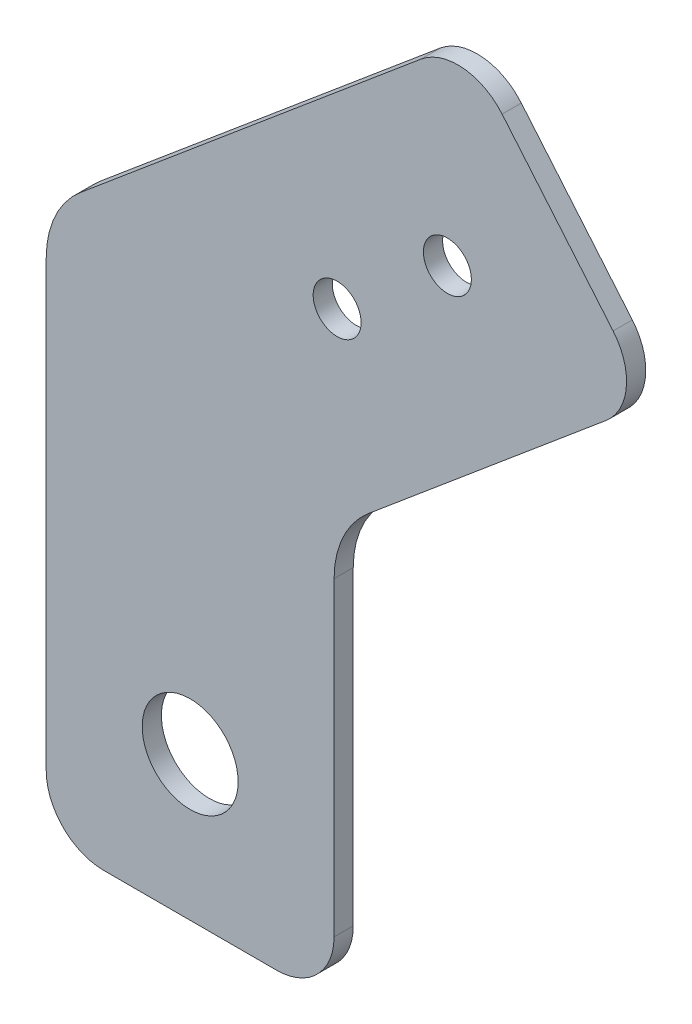
ISO-10303-21;
HEADER;
FILE_DESCRIPTION(('STEP AP214'),'2;1');
FILE_NAME('part.step','',(''),(''),'','','');
FILE_SCHEMA(('AUTOMOTIVE_DESIGN { 1 0 10303 214 1 1 1 1 }'));
ENDSEC;
DATA;
#1=APPLICATION_CONTEXT('core data for automotive mechanical design processes');
#2=APPLICATION_PROTOCOL_DEFINITION('international standard','automotive_design',2000,#1);
#3=PRODUCT_CONTEXT('',#1,'mechanical');
#4=PRODUCT('Part','Part','',(#3));
#5=PRODUCT_RELATED_PRODUCT_CATEGORY('part','',(#4));
#6=PRODUCT_DEFINITION_FORMATION('','',#4);
#7=PRODUCT_DEFINITION_CONTEXT('part definition',#1,'design');
#8=PRODUCT_DEFINITION('design','',#6,#7);
#9=PRODUCT_DEFINITION_SHAPE('','',#8);
#10=(LENGTH_UNIT() NAMED_UNIT(*) SI_UNIT(.MILLI.,.METRE.));
#11=(NAMED_UNIT(*) PLANE_ANGLE_UNIT() SI_UNIT($,.RADIAN.));
#12=(NAMED_UNIT(*) SI_UNIT($,.STERADIAN.) SOLID_ANGLE_UNIT());
#13=UNCERTAINTY_MEASURE_WITH_UNIT(LENGTH_MEASURE(1.E-05),#10,'distance_accuracy_value','');
#14=(GEOMETRIC_REPRESENTATION_CONTEXT(3) GLOBAL_UNCERTAINTY_ASSIGNED_CONTEXT((#13)) GLOBAL_UNIT_ASSIGNED_CONTEXT((#10,
#11,#12)) REPRESENTATION_CONTEXT('',''));
#15=CARTESIAN_POINT('',(0.,0.,0.));
#16=DIRECTION('',(0.,0.,1.));
#17=DIRECTION('',(1.,0.,0.));
#18=AXIS2_PLACEMENT_3D('',#15,#16,#17);
#19=CARTESIAN_POINT('',(-47.3022221559489,-76.1393804843269,-2.));
#20=DIRECTION('',(0.,0.,1.));
#21=DIRECTION('',(1.,0.,0.));
#22=AXIS2_PLACEMENT_3D('',#19,#20,#21);
#23=CYLINDRICAL_SURFACE('',#22,6.);
#24=CARTESIAN_POINT('',(-47.3022221559489,-76.1393804843269,0.));
#25=DIRECTION('',(0.,0.,1.));
#26=DIRECTION('',(-1.,0.,0.));
#27=AXIS2_PLACEMENT_3D('',#24,#25,#26);
#28=CIRCLE('',#27,6.);
#29=CARTESIAN_POINT('',(-53.3022221559489,-76.1393804843269,0.));
#30=VERTEX_POINT('',#29);
#31=CARTESIAN_POINT('',(-47.3022221559489,-82.1393804843269,0.));
#32=VERTEX_POINT('',#31);
#33=EDGE_CURVE('E158',#30,#32,#28,.T.);
#34=ORIENTED_EDGE('',*,*,#33,.F.);
#35=DIRECTION('',(0.,0.,1.));
#36=VECTOR('',#35,1.);
#37=CARTESIAN_POINT('',(-53.3022221559489,-76.1393804843269,-2.));
#38=LINE('',#37,#36);
#39=CARTESIAN_POINT('',(-53.3022221559489,-76.1393804843269,-2.));
#40=VERTEX_POINT('',#39);
#41=EDGE_CURVE('E11',#40,#30,#38,.T.);
#42=ORIENTED_EDGE('',*,*,#41,.F.);
#43=CARTESIAN_POINT('',(-47.3022221559489,-76.1393804843269,-2.));
#44=DIRECTION('',(0.,0.,1.));
#45=DIRECTION('',(-1.,0.,0.));
#46=AXIS2_PLACEMENT_3D('',#43,#44,#45);
#47=CIRCLE('',#46,6.);
#48=CARTESIAN_POINT('',(-47.3022221559489,-82.1393804843269,-2.));
#49=VERTEX_POINT('',#48);
#50=EDGE_CURVE('E189',#40,#49,#47,.T.);
#51=ORIENTED_EDGE('',*,*,#50,.T.);
#52=DIRECTION('',(0.,0.,1.));
#53=VECTOR('',#52,1.);
#54=CARTESIAN_POINT('',(-47.3022221559489,-82.1393804843269,-2.));
#55=LINE('',#54,#53);
#56=EDGE_CURVE('E40',#49,#32,#55,.T.);
#57=ORIENTED_EDGE('',*,*,#56,.T.);
#58=EDGE_LOOP('',(#34,#42,#51,#57));
#59=FACE_BOUND('',#58,.T.);
#60=ADVANCED_FACE('F37',(#59),#23,.T.);
#61=CARTESIAN_POINT('',(-53.3022221559489,-76.1393804843269,-2.));
#62=DIRECTION('',(-1.,0.,0.));
#63=DIRECTION('',(0.,0.,1.));
#64=AXIS2_PLACEMENT_3D('',#61,#62,#63);
#65=PLANE('',#64);
#66=DIRECTION('',(0.,-1.,0.));
#67=VECTOR('',#66,1.);
#68=CARTESIAN_POINT('',(-53.3022221559489,-76.1393804843269,0.));
#69=LINE('',#68,#67);
#70=CARTESIAN_POINT('',(-53.3022221559489,-29.8078421935519,0.));
#71=VERTEX_POINT('',#70);
#72=EDGE_CURVE('E92',#71,#30,#69,.T.);
#73=ORIENTED_EDGE('',*,*,#72,.F.);
#74=DIRECTION('',(0.,0.,1.));
#75=VECTOR('',#74,1.);
#76=CARTESIAN_POINT('',(-53.3022221559489,-29.8078421935519,-2.));
#77=LINE('',#76,#75);
#78=CARTESIAN_POINT('',(-53.3022221559489,-29.8078421935519,-2.));
#79=VERTEX_POINT('',#78);
#80=EDGE_CURVE('E46',#79,#71,#77,.T.);
#81=ORIENTED_EDGE('',*,*,#80,.F.);
#82=DIRECTION('',(0.,-1.,0.));
#83=VECTOR('',#82,1.);
#84=CARTESIAN_POINT('',(-53.3022221559489,-29.8078421935519,-2.));
#85=LINE('',#84,#83);
#86=EDGE_CURVE('E54',#79,#40,#85,.T.);
#87=ORIENTED_EDGE('',*,*,#86,.T.);
#88=ORIENTED_EDGE('',*,*,#41,.T.);
#89=EDGE_LOOP('',(#73,#81,#87,#88));
#90=FACE_BOUND('',#89,.T.);
#91=ADVANCED_FACE('F285',(#90),#65,.T.);
#92=CARTESIAN_POINT('',(-43.3022221559489,-29.8078421935519,-2.));
#93=DIRECTION('',(0.,0.,1.));
#94=DIRECTION('',(1.,0.,0.));
#95=AXIS2_PLACEMENT_3D('',#92,#93,#94);
#96=CYLINDRICAL_SURFACE('',#95,10.);
#97=CARTESIAN_POINT('',(-43.3022221559489,-29.8078421935519,0.));
#98=DIRECTION('',(0.,0.,1.));
#99=DIRECTION('',(1.,0.,0.));
#100=AXIS2_PLACEMENT_3D('',#97,#98,#99);
#101=CIRCLE('',#100,10.);
#102=CARTESIAN_POINT('',(-49.7300982528143,-22.1473977623621,0.));
#103=VERTEX_POINT('',#102);
#104=EDGE_CURVE('E135',#103,#71,#101,.T.);
#105=ORIENTED_EDGE('',*,*,#104,.F.);
#106=DIRECTION('',(0.,0.,1.));
#107=VECTOR('',#106,1.);
#108=CARTESIAN_POINT('',(-49.7300982528143,-22.1473977623621,-2.));
#109=LINE('',#108,#107);
#110=CARTESIAN_POINT('',(-49.7300982528143,-22.1473977623621,-2.));
#111=VERTEX_POINT('',#110);
#112=EDGE_CURVE('E130',#111,#103,#109,.T.);
#113=ORIENTED_EDGE('',*,*,#112,.F.);
#114=CARTESIAN_POINT('',(-43.3022221559489,-29.8078421935519,-2.));
#115=DIRECTION('',(0.,0.,1.));
#116=DIRECTION('',(1.,0.,0.));
#117=AXIS2_PLACEMENT_3D('',#114,#115,#116);
#118=CIRCLE('',#117,10.);
#119=EDGE_CURVE('E133',#111,#79,#118,.T.);
#120=ORIENTED_EDGE('',*,*,#119,.T.);
#121=ORIENTED_EDGE('',*,*,#80,.T.);
#122=EDGE_LOOP('',(#105,#113,#120,#121));
#123=FACE_BOUND('',#122,.T.);
#124=ADVANCED_FACE('F132',(#123),#96,.T.);
#125=CARTESIAN_POINT('',(-14.2380808040119,7.63394098866545,-2.));
#126=DIRECTION('',(-0.642787609686538,0.766044443118979,0.));
#127=DIRECTION('',(-0.766044443118979,-0.642787609686538,0.));
#128=AXIS2_PLACEMENT_3D('',#125,#126,#127);
#129=PLANE('',#128);
#130=DIRECTION('',(-0.766044443118979,-0.642787609686538,0.));
#131=VECTOR('',#130,1.);
#132=CARTESIAN_POINT('',(-14.2380808040119,7.63394098866545,0.));
#133=LINE('',#132,#131);
#134=CARTESIAN_POINT('',(-14.2380808040119,7.63394098866545,0.));
#135=VERTEX_POINT('',#134);
#136=EDGE_CURVE('E186',#135,#103,#133,.T.);
#137=ORIENTED_EDGE('',*,*,#136,.F.);
#138=DIRECTION('',(0.,0.,1.));
#139=VECTOR('',#138,1.);
#140=CARTESIAN_POINT('',(-14.2380808040119,7.63394098866545,-2.));
#141=LINE('',#140,#139);
#142=CARTESIAN_POINT('',(-14.2380808040119,7.63394098866545,-2.));
#143=VERTEX_POINT('',#142);
#144=EDGE_CURVE('E140',#143,#135,#141,.T.);
#145=ORIENTED_EDGE('',*,*,#144,.F.);
#146=DIRECTION('',(-0.766044443118979,-0.642787609686538,0.));
#147=VECTOR('',#146,1.);
#148=CARTESIAN_POINT('',(-14.2380808040119,7.63394098866545,-2.));
#149=LINE('',#148,#147);
#150=EDGE_CURVE('E147',#143,#111,#149,.T.);
#151=ORIENTED_EDGE('',*,*,#150,.T.);
#152=ORIENTED_EDGE('',*,*,#112,.T.);
#153=EDGE_LOOP('',(#137,#145,#151,#152));
#154=FACE_BOUND('',#153,.T.);
#155=ADVANCED_FACE('F150',(#154),#129,.T.);
#156=CARTESIAN_POINT('',(-10.3813551458927,3.03767432995158,-2.));
#157=DIRECTION('',(0.,0.,1.));
#158=DIRECTION('',(1.,0.,0.));
#159=AXIS2_PLACEMENT_3D('',#156,#157,#158);
#160=CYLINDRICAL_SURFACE('',#159,6.);
#161=CARTESIAN_POINT('',(-10.3813551458927,3.03767432995158,0.));
#162=DIRECTION('',(0.,0.,1.));
#163=DIRECTION('',(-1.,0.,0.));
#164=AXIS2_PLACEMENT_3D('',#161,#162,#163);
#165=CIRCLE('',#164,6.);
#166=CARTESIAN_POINT('',(-5.78508848717884,6.89439998807081,0.));
#167=VERTEX_POINT('',#166);
#168=EDGE_CURVE('E183',#167,#135,#165,.T.);
#169=ORIENTED_EDGE('',*,*,#168,.F.);
#170=DIRECTION('',(0.,0.,1.));
#171=VECTOR('',#170,1.);
#172=CARTESIAN_POINT('',(-5.78508848717884,6.89439998807081,-2.));
#173=LINE('',#172,#171);
#174=CARTESIAN_POINT('',(-5.78508848717884,6.89439998807081,-2.));
#175=VERTEX_POINT('',#174);
#176=EDGE_CURVE('E193',#175,#167,#173,.T.);
#177=ORIENTED_EDGE('',*,*,#176,.F.);
#178=CARTESIAN_POINT('',(-10.3813551458927,3.03767432995158,-2.));
#179=DIRECTION('',(0.,0.,1.));
#180=DIRECTION('',(-1.,0.,0.));
#181=AXIS2_PLACEMENT_3D('',#178,#179,#180);
#182=CIRCLE('',#181,6.);
#183=EDGE_CURVE('E151',#175,#143,#182,.T.);
#184=ORIENTED_EDGE('',*,*,#183,.T.);
#185=ORIENTED_EDGE('',*,*,#144,.T.);
#186=EDGE_LOOP('',(#169,#177,#184,#185));
#187=FACE_BOUND('',#186,.T.);
#188=ADVANCED_FACE('F215',(#187),#160,.T.);
#189=CARTESIAN_POINT('',(5.78508848717885,-6.89439998807081,-2.));
#190=DIRECTION('',(0.766044443118979,0.642787609686538,0.));
#191=DIRECTION('',(-0.642787609686538,0.766044443118979,0.));
#192=AXIS2_PLACEMENT_3D('',#189,#190,#191);
#193=PLANE('',#192);
#194=DIRECTION('',(-0.642787609686538,0.766044443118979,0.));
#195=VECTOR('',#194,1.);
#196=CARTESIAN_POINT('',(5.78508848717885,-6.89439998807081,0.));
#197=LINE('',#196,#195);
#198=CARTESIAN_POINT('',(5.78508848717885,-6.89439998807081,0.));
#199=VERTEX_POINT('',#198);
#200=EDGE_CURVE('E180',#199,#167,#197,.T.);
#201=ORIENTED_EDGE('',*,*,#200,.F.);
#202=DIRECTION('',(0.,0.,1.));
#203=VECTOR('',#202,1.);
#204=CARTESIAN_POINT('',(5.78508848717885,-6.89439998807081,-2.));
#205=LINE('',#204,#203);
#206=CARTESIAN_POINT('',(5.78508848717885,-6.89439998807081,-2.));
#207=VERTEX_POINT('',#206);
#208=EDGE_CURVE('E195',#207,#199,#205,.T.);
#209=ORIENTED_EDGE('',*,*,#208,.F.);
#210=DIRECTION('',(-0.642787609686538,0.766044443118979,0.));
#211=VECTOR('',#210,1.);
#212=CARTESIAN_POINT('',(5.78508848717885,-6.89439998807081,-2.));
#213=LINE('',#212,#211);
#214=EDGE_CURVE('E153',#207,#175,#213,.T.);
#215=ORIENTED_EDGE('',*,*,#214,.T.);
#216=ORIENTED_EDGE('',*,*,#176,.T.);
#217=EDGE_LOOP('',(#201,#209,#215,#216));
#218=FACE_BOUND('',#217,.T.);
#219=ADVANCED_FACE('F221',(#218),#193,.T.);
#220=CARTESIAN_POINT('',(1.18882182846497,-10.75112564619,-2.));
#221=DIRECTION('',(0.,0.,1.));
#222=DIRECTION('',(1.,0.,0.));
#223=AXIS2_PLACEMENT_3D('',#220,#221,#222);
#224=CYLINDRICAL_SURFACE('',#223,6.);
#225=CARTESIAN_POINT('',(1.18882182846497,-10.75112564619,0.));
#226=DIRECTION('',(0.,0.,1.));
#227=DIRECTION('',(1.,0.,0.));
#228=AXIS2_PLACEMENT_3D('',#225,#226,#227);
#229=CIRCLE('',#228,6.);
#230=CARTESIAN_POINT('',(5.0455474865842,-15.3473923049039,0.));
#231=VERTEX_POINT('',#230);
#232=EDGE_CURVE('E177',#231,#199,#229,.T.);
#233=ORIENTED_EDGE('',*,*,#232,.F.);
#234=DIRECTION('',(0.,0.,1.));
#235=VECTOR('',#234,1.);
#236=CARTESIAN_POINT('',(5.0455474865842,-15.3473923049039,-2.));
#237=LINE('',#236,#235);
#238=CARTESIAN_POINT('',(5.0455474865842,-15.3473923049039,-2.));
#239=VERTEX_POINT('',#238);
#240=EDGE_CURVE('E197',#239,#231,#237,.T.);
#241=ORIENTED_EDGE('',*,*,#240,.F.);
#242=CARTESIAN_POINT('',(1.18882182846497,-10.75112564619,-2.));
#243=DIRECTION('',(0.,0.,1.));
#244=DIRECTION('',(1.,0.,0.));
#245=AXIS2_PLACEMENT_3D('',#242,#243,#244);
#246=CIRCLE('',#245,6.);
#247=EDGE_CURVE('E222',#239,#207,#246,.T.);
#248=ORIENTED_EDGE('',*,*,#247,.T.);
#249=ORIENTED_EDGE('',*,*,#208,.T.);
#250=EDGE_LOOP('',(#233,#241,#248,#249));
#251=FACE_BOUND('',#250,.T.);
#252=ADVANCED_FACE('F301',(#251),#224,.T.);
#253=CARTESIAN_POINT('',(5.0455474865842,-15.3473923049039,-2.));
#254=DIRECTION('',(0.642787609686538,-0.766044443118979,0.));
#255=DIRECTION('',(0.766044443118979,0.642787609686538,0.));
#256=AXIS2_PLACEMENT_3D('',#253,#254,#255);
#257=PLANE('',#256);
#258=DIRECTION('',(0.766044443118979,0.642787609686538,0.));
#259=VECTOR('',#258,1.);
#260=CARTESIAN_POINT('',(5.0455474865842,-15.3473923049039,0.));
#261=LINE('',#260,#259);
#262=CARTESIAN_POINT('',(-19.7300982528143,-36.1366275070121,0.));
#263=VERTEX_POINT('',#262);
#264=EDGE_CURVE('E174',#263,#231,#261,.T.);
#265=ORIENTED_EDGE('',*,*,#264,.F.);
#266=DIRECTION('',(0.,0.,1.));
#267=VECTOR('',#266,1.);
#268=CARTESIAN_POINT('',(-19.7300982528143,-36.1366275070121,-2.));
#269=LINE('',#268,#267);
#270=CARTESIAN_POINT('',(-19.7300982528143,-36.1366275070121,-2.));
#271=VERTEX_POINT('',#270);
#272=EDGE_CURVE('E199',#271,#263,#269,.T.);
#273=ORIENTED_EDGE('',*,*,#272,.F.);
#274=DIRECTION('',(0.766044443118979,0.642787609686538,0.));
#275=VECTOR('',#274,1.);
#276=CARTESIAN_POINT('',(5.0455474865842,-15.3473923049039,-2.));
#277=LINE('',#276,#275);
#278=EDGE_CURVE('E223',#271,#239,#277,.T.);
#279=ORIENTED_EDGE('',*,*,#278,.T.);
#280=ORIENTED_EDGE('',*,*,#240,.T.);
#281=EDGE_LOOP('',(#265,#273,#279,#280));
#282=FACE_BOUND('',#281,.T.);
#283=ADVANCED_FACE('F304',(#282),#257,.T.);
#284=CARTESIAN_POINT('',(-13.3022221559489,-43.7970719382019,-2.));
#285=DIRECTION('',(0.,0.,1.));
#286=DIRECTION('',(1.,0.,0.));
#287=AXIS2_PLACEMENT_3D('',#284,#285,#286);
#288=CYLINDRICAL_SURFACE('',#287,10.);
#289=CARTESIAN_POINT('',(-13.3022221559489,-43.7970719382019,0.));
#290=DIRECTION('',(0.,0.,-1.));
#291=DIRECTION('',(1.,0.,0.));
#292=AXIS2_PLACEMENT_3D('',#289,#290,#291);
#293=CIRCLE('',#292,10.);
#294=CARTESIAN_POINT('',(-23.302222155949,-43.7970719382019,0.));
#295=VERTEX_POINT('',#294);
#296=EDGE_CURVE('E171',#295,#263,#293,.T.);
#297=ORIENTED_EDGE('',*,*,#296,.F.);
#298=DIRECTION('',(0.,0.,1.));
#299=VECTOR('',#298,1.);
#300=CARTESIAN_POINT('',(-23.302222155949,-43.7970719382019,-2.));
#301=LINE('',#300,#299);
#302=CARTESIAN_POINT('',(-23.302222155949,-43.7970719382019,-2.));
#303=VERTEX_POINT('',#302);
#304=EDGE_CURVE('E201',#303,#295,#301,.T.);
#305=ORIENTED_EDGE('',*,*,#304,.F.);
#306=CARTESIAN_POINT('',(-13.3022221559489,-43.7970719382019,-2.));
#307=DIRECTION('',(0.,0.,-1.));
#308=DIRECTION('',(1.,0.,0.));
#309=AXIS2_PLACEMENT_3D('',#306,#307,#308);
#310=CIRCLE('',#309,10.);
#311=EDGE_CURVE('E228',#303,#271,#310,.T.);
#312=ORIENTED_EDGE('',*,*,#311,.T.);
#313=ORIENTED_EDGE('',*,*,#272,.T.);
#314=EDGE_LOOP('',(#297,#305,#312,#313));
#315=FACE_BOUND('',#314,.T.);
#316=ADVANCED_FACE('F308',(#315),#288,.F.);
#317=CARTESIAN_POINT('',(-23.302222155949,-43.7970719382019,-2.));
#318=DIRECTION('',(1.,0.,0.));
#319=DIRECTION('',(0.,1.,0.));
#320=AXIS2_PLACEMENT_3D('',#317,#318,#319);
#321=PLANE('',#320);
#322=DIRECTION('',(0.,1.,0.));
#323=VECTOR('',#322,1.);
#324=CARTESIAN_POINT('',(-23.302222155949,-43.7970719382019,0.));
#325=LINE('',#324,#323);
#326=CARTESIAN_POINT('',(-23.3022221559489,-76.1393804843269,0.));
#327=VERTEX_POINT('',#326);
#328=EDGE_CURVE('E168',#327,#295,#325,.T.);
#329=ORIENTED_EDGE('',*,*,#328,.F.);
#330=DIRECTION('',(0.,0.,1.));
#331=VECTOR('',#330,1.);
#332=CARTESIAN_POINT('',(-23.3022221559489,-76.1393804843269,-2.));
#333=LINE('',#332,#331);
#334=CARTESIAN_POINT('',(-23.3022221559489,-76.1393804843269,-2.));
#335=VERTEX_POINT('',#334);
#336=EDGE_CURVE('E203',#335,#327,#333,.T.);
#337=ORIENTED_EDGE('',*,*,#336,.F.);
#338=DIRECTION('',(0.,1.,0.));
#339=VECTOR('',#338,1.);
#340=CARTESIAN_POINT('',(-23.3022221559489,-48.561641660225,-2.));
#341=LINE('',#340,#339);
#342=EDGE_CURVE('E231',#335,#303,#341,.T.);
#343=ORIENTED_EDGE('',*,*,#342,.T.);
#344=ORIENTED_EDGE('',*,*,#304,.T.);
#345=EDGE_LOOP('',(#329,#337,#343,#344));
#346=FACE_BOUND('',#345,.T.);
#347=ADVANCED_FACE('F312',(#346),#321,.T.);
#348=CARTESIAN_POINT('',(-29.3022221559489,-76.1393804843269,-2.));
#349=DIRECTION('',(0.,0.,1.));
#350=DIRECTION('',(1.,0.,0.));
#351=AXIS2_PLACEMENT_3D('',#348,#349,#350);
#352=CYLINDRICAL_SURFACE('',#351,6.);
#353=CARTESIAN_POINT('',(-29.3022221559489,-76.1393804843269,0.));
#354=DIRECTION('',(0.,0.,1.));
#355=DIRECTION('',(-1.,0.,0.));
#356=AXIS2_PLACEMENT_3D('',#353,#354,#355);
#357=CIRCLE('',#356,6.);
#358=CARTESIAN_POINT('',(-29.3022221559489,-82.1393804843269,0.));
#359=VERTEX_POINT('',#358);
#360=EDGE_CURVE('E165',#359,#327,#357,.T.);
#361=ORIENTED_EDGE('',*,*,#360,.F.);
#362=DIRECTION('',(0.,0.,1.));
#363=VECTOR('',#362,1.);
#364=CARTESIAN_POINT('',(-29.3022221559489,-82.1393804843269,-2.));
#365=LINE('',#364,#363);
#366=CARTESIAN_POINT('',(-29.3022221559489,-82.1393804843269,-2.));
#367=VERTEX_POINT('',#366);
#368=EDGE_CURVE('E205',#367,#359,#365,.T.);
#369=ORIENTED_EDGE('',*,*,#368,.F.);
#370=CARTESIAN_POINT('',(-29.3022221559489,-76.1393804843269,-2.));
#371=DIRECTION('',(0.,0.,1.));
#372=DIRECTION('',(-1.,0.,0.));
#373=AXIS2_PLACEMENT_3D('',#370,#371,#372);
#374=CIRCLE('',#373,6.);
#375=EDGE_CURVE('E233',#367,#335,#374,.T.);
#376=ORIENTED_EDGE('',*,*,#375,.T.);
#377=ORIENTED_EDGE('',*,*,#336,.T.);
#378=EDGE_LOOP('',(#361,#369,#376,#377));
#379=FACE_BOUND('',#378,.T.);
#380=ADVANCED_FACE('F316',(#379),#352,.T.);
#381=CARTESIAN_POINT('',(-29.3022221559489,-82.1393804843269,-2.));
#382=DIRECTION('',(0.,-1.,0.));
#383=DIRECTION('',(0.,0.,-1.));
#384=AXIS2_PLACEMENT_3D('',#381,#382,#383);
#385=PLANE('',#384);
#386=DIRECTION('',(1.,0.,0.));
#387=VECTOR('',#386,1.);
#388=CARTESIAN_POINT('',(-29.3022221559489,-82.1393804843269,0.));
#389=LINE('',#388,#387);
#390=EDGE_CURVE('E161',#32,#359,#389,.T.);
#391=ORIENTED_EDGE('',*,*,#390,.F.);
#392=ORIENTED_EDGE('',*,*,#56,.F.);
#393=DIRECTION('',(1.,0.,0.));
#394=VECTOR('',#393,1.);
#395=CARTESIAN_POINT('',(-29.3022221559489,-82.1393804843269,-2.));
#396=LINE('',#395,#394);
#397=EDGE_CURVE('E236',#49,#367,#396,.T.);
#398=ORIENTED_EDGE('',*,*,#397,.T.);
#399=ORIENTED_EDGE('',*,*,#368,.T.);
#400=EDGE_LOOP('',(#391,#392,#398,#399));
#401=FACE_BOUND('',#400,.T.);
#402=ADVANCED_FACE('F209',(#401),#385,.T.);
#403=CARTESIAN_POINT('',(-47.3022221559489,-76.1393804843269,-2.));
#404=DIRECTION('',(0.,0.,-1.));
#405=DIRECTION('',(-1.,0.,0.));
#406=AXIS2_PLACEMENT_3D('',#403,#404,#405);
#407=PLANE('',#406);
#408=CARTESIAN_POINT('',(-22.9813332935694,-19.2836282905961,-2.));
#409=DIRECTION('',(0.,0.,1.));
#410=DIRECTION('',(1.,0.,0.));
#411=AXIS2_PLACEMENT_3D('',#408,#409,#410);
#412=CIRCLE('',#411,2.5);
#413=CARTESIAN_POINT('',(-20.4813332935694,-19.2836282905961,-2.));
#414=VERTEX_POINT('',#413);
#415=EDGE_CURVE('E248',#414,#414,#412,.T.);
#416=ORIENTED_EDGE('',*,*,#415,.T.);
#417=EDGE_LOOP('',(#416));
#418=FACE_BOUND('',#417,.T.);
#419=CARTESIAN_POINT('',(-11.4906666467847,-9.64181414529807,-2.));
#420=DIRECTION('',(0.,0.,1.));
#421=DIRECTION('',(1.,0.,0.));
#422=AXIS2_PLACEMENT_3D('',#419,#420,#421);
#423=CIRCLE('',#422,2.5);
#424=CARTESIAN_POINT('',(-8.99066664678469,-9.64181414529807,-2.));
#425=VERTEX_POINT('',#424);
#426=EDGE_CURVE('E242',#425,#425,#423,.T.);
#427=ORIENTED_EDGE('',*,*,#426,.T.);
#428=EDGE_LOOP('',(#427));
#429=FACE_BOUND('',#428,.T.);
#430=CARTESIAN_POINT('',(-38.3022221559489,-67.1393804843269,-2.));
#431=DIRECTION('',(0.,0.,1.));
#432=DIRECTION('',(1.,0.,0.));
#433=AXIS2_PLACEMENT_3D('',#430,#431,#432);
#434=CIRCLE('',#433,5.);
#435=CARTESIAN_POINT('',(-33.3022221559489,-67.1393804843269,-2.));
#436=VERTEX_POINT('',#435);
#437=EDGE_CURVE('E162',#436,#436,#434,.T.);
#438=ORIENTED_EDGE('',*,*,#437,.T.);
#439=EDGE_LOOP('',(#438));
#440=FACE_BOUND('',#439,.T.);
#441=ORIENTED_EDGE('',*,*,#50,.F.);
#442=ORIENTED_EDGE('',*,*,#86,.F.);
#443=ORIENTED_EDGE('',*,*,#119,.F.);
#444=ORIENTED_EDGE('',*,*,#150,.F.);
#445=ORIENTED_EDGE('',*,*,#183,.F.);
#446=ORIENTED_EDGE('',*,*,#214,.F.);
#447=ORIENTED_EDGE('',*,*,#247,.F.);
#448=ORIENTED_EDGE('',*,*,#278,.F.);
#449=ORIENTED_EDGE('',*,*,#311,.F.);
#450=ORIENTED_EDGE('',*,*,#342,.F.);
#451=ORIENTED_EDGE('',*,*,#375,.F.);
#452=ORIENTED_EDGE('',*,*,#397,.F.);
#453=EDGE_LOOP('',(#441,#442,#443,#444,#445,#446,#447,#448,#449,#450,#451,#452));
#454=FACE_BOUND('',#453,.T.);
#455=ADVANCED_FACE('F145',(#418,#429,#440,#454),#407,.T.);
#456=CARTESIAN_POINT('',(-47.3022221559489,-76.1393804843269,0.));
#457=DIRECTION('',(0.,0.,-1.));
#458=DIRECTION('',(-1.,0.,0.));
#459=AXIS2_PLACEMENT_3D('',#456,#457,#458);
#460=PLANE('',#459);
#461=CARTESIAN_POINT('',(-22.9813332935694,-19.2836282905961,0.));
#462=DIRECTION('',(0.,0.,1.));
#463=DIRECTION('',(1.,0.,0.));
#464=AXIS2_PLACEMENT_3D('',#461,#462,#463);
#465=CIRCLE('',#464,2.5);
#466=CARTESIAN_POINT('',(-20.4813332935694,-19.2836282905961,0.));
#467=VERTEX_POINT('',#466);
#468=EDGE_CURVE('E251',#467,#467,#465,.T.);
#469=ORIENTED_EDGE('',*,*,#468,.F.);
#470=EDGE_LOOP('',(#469));
#471=FACE_BOUND('',#470,.T.);
#472=CARTESIAN_POINT('',(-11.4906666467847,-9.64181414529807,0.));
#473=DIRECTION('',(0.,0.,1.));
#474=DIRECTION('',(1.,0.,0.));
#475=AXIS2_PLACEMENT_3D('',#472,#473,#474);
#476=CIRCLE('',#475,2.5);
#477=CARTESIAN_POINT('',(-8.99066664678469,-9.64181414529807,0.));
#478=VERTEX_POINT('',#477);
#479=EDGE_CURVE('E245',#478,#478,#476,.T.);
#480=ORIENTED_EDGE('',*,*,#479,.F.);
#481=EDGE_LOOP('',(#480));
#482=FACE_BOUND('',#481,.T.);
#483=CARTESIAN_POINT('',(-38.3022221559489,-67.1393804843269,0.));
#484=DIRECTION('',(0.,0.,1.));
#485=DIRECTION('',(1.,0.,0.));
#486=AXIS2_PLACEMENT_3D('',#483,#484,#485);
#487=CIRCLE('',#486,5.);
#488=CARTESIAN_POINT('',(-33.3022221559489,-67.1393804843269,0.));
#489=VERTEX_POINT('',#488);
#490=EDGE_CURVE('E239',#489,#489,#487,.T.);
#491=ORIENTED_EDGE('',*,*,#490,.F.);
#492=EDGE_LOOP('',(#491));
#493=FACE_BOUND('',#492,.T.);
#494=ORIENTED_EDGE('',*,*,#33,.T.);
#495=ORIENTED_EDGE('',*,*,#390,.T.);
#496=ORIENTED_EDGE('',*,*,#360,.T.);
#497=ORIENTED_EDGE('',*,*,#328,.T.);
#498=ORIENTED_EDGE('',*,*,#296,.T.);
#499=ORIENTED_EDGE('',*,*,#264,.T.);
#500=ORIENTED_EDGE('',*,*,#232,.T.);
#501=ORIENTED_EDGE('',*,*,#200,.T.);
#502=ORIENTED_EDGE('',*,*,#168,.T.);
#503=ORIENTED_EDGE('',*,*,#136,.T.);
#504=ORIENTED_EDGE('',*,*,#104,.T.);
#505=ORIENTED_EDGE('',*,*,#72,.T.);
#506=EDGE_LOOP('',(#494,#495,#496,#497,#498,#499,#500,#501,#502,#503,#504,#505));
#507=FACE_BOUND('',#506,.T.);
#508=ADVANCED_FACE('F211',(#471,#482,#493,#507),#460,.F.);
#509=CARTESIAN_POINT('',(-38.3022221559489,-67.1393804843269,-2.));
#510=DIRECTION('',(0.,0.,1.));
#511=DIRECTION('',(1.,0.,0.));
#512=AXIS2_PLACEMENT_3D('',#509,#510,#511);
#513=CYLINDRICAL_SURFACE('',#512,5.);
#514=ORIENTED_EDGE('',*,*,#437,.F.);
#515=EDGE_LOOP('',(#514));
#516=FACE_BOUND('',#515,.T.);
#517=ORIENTED_EDGE('',*,*,#490,.T.);
#518=EDGE_LOOP('',(#517));
#519=FACE_BOUND('',#518,.T.);
#520=ADVANCED_FACE('F268',(#516,#519),#513,.F.);
#521=CARTESIAN_POINT('',(-11.4906666467847,-9.64181414529807,-2.));
#522=DIRECTION('',(0.,0.,1.));
#523=DIRECTION('',(1.,0.,0.));
#524=AXIS2_PLACEMENT_3D('',#521,#522,#523);
#525=CYLINDRICAL_SURFACE('',#524,2.5);
#526=ORIENTED_EDGE('',*,*,#426,.F.);
#527=EDGE_LOOP('',(#526));
#528=FACE_BOUND('',#527,.T.);
#529=ORIENTED_EDGE('',*,*,#479,.T.);
#530=EDGE_LOOP('',(#529));
#531=FACE_BOUND('',#530,.T.);
#532=ADVANCED_FACE('F262',(#528,#531),#525,.F.);
#533=CARTESIAN_POINT('',(-22.9813332935694,-19.2836282905961,-2.));
#534=DIRECTION('',(0.,0.,1.));
#535=DIRECTION('',(1.,0.,0.));
#536=AXIS2_PLACEMENT_3D('',#533,#534,#535);
#537=CYLINDRICAL_SURFACE('',#536,2.5);
#538=ORIENTED_EDGE('',*,*,#415,.F.);
#539=EDGE_LOOP('',(#538));
#540=FACE_BOUND('',#539,.T.);
#541=ORIENTED_EDGE('',*,*,#468,.T.);
#542=EDGE_LOOP('',(#541));
#543=FACE_BOUND('',#542,.T.);
#544=ADVANCED_FACE('F259',(#540,#543),#537,.F.);
#545=CLOSED_SHELL('',(#60,#91,#124,#155,#188,#219,#252,#283,#316,#347,#380,#402,#455,#508,#520,
#532,#544));
#546=MANIFOLD_SOLID_BREP('B2',#545);
#547=ADVANCED_BREP_SHAPE_REPRESENTATION('',(#18,#546),#14);
#548=SHAPE_DEFINITION_REPRESENTATION(#9,#547);
ENDSEC;
END-ISO-10303-21;
